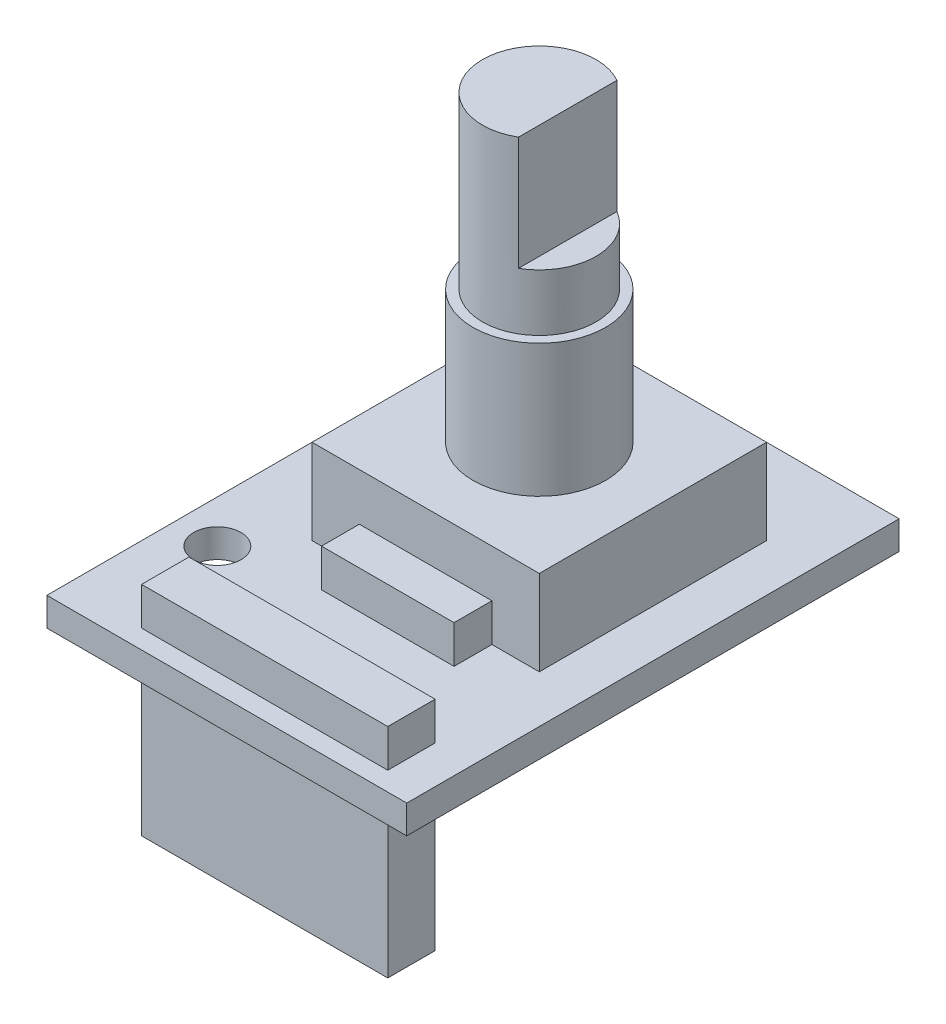
ISO-10303-21;
HEADER;
FILE_DESCRIPTION(('STEP AP214'),'2;1');
FILE_NAME('part.step','',(''),(''),'','','');
FILE_SCHEMA(('AUTOMOTIVE_DESIGN { 1 0 10303 214 1 1 1 1 }'));
ENDSEC;
DATA;
#1=APPLICATION_CONTEXT('core data for automotive mechanical design processes');
#2=APPLICATION_PROTOCOL_DEFINITION('international standard','automotive_design',2000,#1);
#3=PRODUCT_CONTEXT('',#1,'mechanical');
#4=PRODUCT('Part','Part','',(#3));
#5=PRODUCT_RELATED_PRODUCT_CATEGORY('part','',(#4));
#6=PRODUCT_DEFINITION_FORMATION('','',#4);
#7=PRODUCT_DEFINITION_CONTEXT('part definition',#1,'design');
#8=PRODUCT_DEFINITION('design','',#6,#7);
#9=PRODUCT_DEFINITION_SHAPE('','',#8);
#10=(LENGTH_UNIT() NAMED_UNIT(*) SI_UNIT(.MILLI.,.METRE.));
#11=(NAMED_UNIT(*) PLANE_ANGLE_UNIT() SI_UNIT($,.RADIAN.));
#12=(NAMED_UNIT(*) SI_UNIT($,.STERADIAN.) SOLID_ANGLE_UNIT());
#13=UNCERTAINTY_MEASURE_WITH_UNIT(LENGTH_MEASURE(1.E-05),#10,'distance_accuracy_value','');
#14=(GEOMETRIC_REPRESENTATION_CONTEXT(3) GLOBAL_UNCERTAINTY_ASSIGNED_CONTEXT((#13)) GLOBAL_UNIT_ASSIGNED_CONTEXT((#10,
#11,#12)) REPRESENTATION_CONTEXT('',''));
#15=CARTESIAN_POINT('',(0.,0.,0.));
#16=DIRECTION('',(0.,0.,1.));
#17=DIRECTION('',(1.,0.,0.));
#18=AXIS2_PLACEMENT_3D('',#15,#16,#17);
#19=CARTESIAN_POINT('',(0.,1.5,0.));
#20=DIRECTION('',(0.,-1.,0.));
#21=DIRECTION('',(0.,0.,-1.));
#22=AXIS2_PLACEMENT_3D('',#19,#20,#21);
#23=PLANE('',#22);
#24=DIRECTION('',(-1.,0.,0.));
#25=VECTOR('',#24,1.);
#26=CARTESIAN_POINT('',(0.,1.5,12.));
#27=LINE('',#26,#25);
#28=CARTESIAN_POINT('',(7.5,1.5,12.));
#29=VERTEX_POINT('',#28);
#30=CARTESIAN_POINT('',(-5.5,1.5,12.));
#31=VERTEX_POINT('',#30);
#32=EDGE_CURVE('E360',#29,#31,#27,.T.);
#33=ORIENTED_EDGE('',*,*,#32,.T.);
#34=DIRECTION('',(0.,0.,-1.));
#35=VECTOR('',#34,1.);
#36=CARTESIAN_POINT('',(-5.5,1.5,0.));
#37=LINE('',#36,#35);
#38=CARTESIAN_POINT('',(-5.5,1.5,9.5));
#39=VERTEX_POINT('',#38);
#40=EDGE_CURVE('E369',#31,#39,#37,.T.);
#41=ORIENTED_EDGE('',*,*,#40,.T.);
#42=DIRECTION('',(1.,0.,0.));
#43=VECTOR('',#42,1.);
#44=CARTESIAN_POINT('',(0.,1.5,9.5));
#45=LINE('',#44,#43);
#46=CARTESIAN_POINT('',(7.5,1.5,9.5));
#47=VERTEX_POINT('',#46);
#48=EDGE_CURVE('E366',#39,#47,#45,.T.);
#49=ORIENTED_EDGE('',*,*,#48,.T.);
#50=DIRECTION('',(0.,0.,1.));
#51=VECTOR('',#50,1.);
#52=CARTESIAN_POINT('',(7.5,1.5,0.));
#53=LINE('',#52,#51);
#54=EDGE_CURVE('E363',#47,#29,#53,.T.);
#55=ORIENTED_EDGE('',*,*,#54,.T.);
#56=EDGE_LOOP('',(#33,#41,#49,#55));
#57=FACE_BOUND('',#56,.T.);
#58=CARTESIAN_POINT('',(-7.25,1.5,-7.75));
#59=DIRECTION('',(0.,1.,0.));
#60=DIRECTION('',(0.,0.,1.));
#61=AXIS2_PLACEMENT_3D('',#58,#59,#60);
#62=CIRCLE('',#61,1.25);
#63=CARTESIAN_POINT('',(-7.25,1.5,-6.5));
#64=VERTEX_POINT('',#63);
#65=EDGE_CURVE('E321',#64,#64,#62,.T.);
#66=ORIENTED_EDGE('',*,*,#65,.F.);
#67=EDGE_LOOP('',(#66));
#68=FACE_BOUND('',#67,.T.);
#69=CARTESIAN_POINT('',(-7.25,1.5,6.25));
#70=DIRECTION('',(0.,1.,0.));
#71=DIRECTION('',(0.,0.,1.));
#72=AXIS2_PLACEMENT_3D('',#69,#70,#71);
#73=CIRCLE('',#72,1.25);
#74=CARTESIAN_POINT('',(-7.25,1.5,7.5));
#75=VERTEX_POINT('',#74);
#76=EDGE_CURVE('E372',#75,#75,#73,.T.);
#77=ORIENTED_EDGE('',*,*,#76,.F.);
#78=EDGE_LOOP('',(#77));
#79=FACE_BOUND('',#78,.T.);
#80=DIRECTION('',(0.,0.,1.));
#81=VECTOR('',#80,1.);
#82=CARTESIAN_POINT('',(-9.5,1.5,13.));
#83=LINE('',#82,#81);
#84=CARTESIAN_POINT('',(-9.5,1.5,-13.));
#85=VERTEX_POINT('',#84);
#86=CARTESIAN_POINT('',(-9.5,1.5,13.));
#87=VERTEX_POINT('',#86);
#88=EDGE_CURVE('E287',#85,#87,#83,.T.);
#89=ORIENTED_EDGE('',*,*,#88,.T.);
#90=DIRECTION('',(1.,0.,0.));
#91=VECTOR('',#90,1.);
#92=CARTESIAN_POINT('',(-9.5,1.5,13.));
#93=LINE('',#92,#91);
#94=CARTESIAN_POINT('',(9.5,1.5,13.));
#95=VERTEX_POINT('',#94);
#96=EDGE_CURVE('E290',#87,#95,#93,.T.);
#97=ORIENTED_EDGE('',*,*,#96,.T.);
#98=DIRECTION('',(0.,0.,-1.));
#99=VECTOR('',#98,1.);
#100=CARTESIAN_POINT('',(9.5,1.5,13.));
#101=LINE('',#100,#99);
#102=CARTESIAN_POINT('',(9.5,1.5,-13.));
#103=VERTEX_POINT('',#102);
#104=EDGE_CURVE('E293',#95,#103,#101,.T.);
#105=ORIENTED_EDGE('',*,*,#104,.T.);
#106=DIRECTION('',(-1.,0.,0.));
#107=VECTOR('',#106,1.);
#108=CARTESIAN_POINT('',(-9.5,1.5,-13.));
#109=LINE('',#108,#107);
#110=EDGE_CURVE('E295',#103,#85,#109,.T.);
#111=ORIENTED_EDGE('',*,*,#110,.T.);
#112=EDGE_LOOP('',(#89,#97,#105,#111));
#113=FACE_BOUND('',#112,.T.);
#114=DIRECTION('',(0.,0.,1.));
#115=VECTOR('',#114,1.);
#116=CARTESIAN_POINT('',(-2.5,1.5,3.5));
#117=LINE('',#116,#115);
#118=CARTESIAN_POINT('',(-2.5,1.5,3.5));
#119=VERTEX_POINT('',#118);
#120=CARTESIAN_POINT('',(-2.5,1.5,5.5));
#121=VERTEX_POINT('',#120);
#122=EDGE_CURVE('E242',#119,#121,#117,.T.);
#123=ORIENTED_EDGE('',*,*,#122,.F.);
#124=DIRECTION('',(1.,0.,0.));
#125=VECTOR('',#124,1.);
#126=CARTESIAN_POINT('',(-5.,1.5,3.5));
#127=LINE('',#126,#125);
#128=CARTESIAN_POINT('',(-5.,1.5,3.5));
#129=VERTEX_POINT('',#128);
#130=EDGE_CURVE('E252',#129,#119,#127,.T.);
#131=ORIENTED_EDGE('',*,*,#130,.F.);
#132=DIRECTION('',(0.,0.,1.));
#133=VECTOR('',#132,1.);
#134=CARTESIAN_POINT('',(-5.,1.5,3.5));
#135=LINE('',#134,#133);
#136=CARTESIAN_POINT('',(-5.,1.5,-8.5));
#137=VERTEX_POINT('',#136);
#138=EDGE_CURVE('E267',#137,#129,#135,.T.);
#139=ORIENTED_EDGE('',*,*,#138,.F.);
#140=DIRECTION('',(-1.,0.,0.));
#141=VECTOR('',#140,1.);
#142=CARTESIAN_POINT('',(-5.,1.5,-8.5));
#143=LINE('',#142,#141);
#144=CARTESIAN_POINT('',(-2.5,1.5,-8.5));
#145=VERTEX_POINT('',#144);
#146=EDGE_CURVE('E265',#145,#137,#143,.T.);
#147=ORIENTED_EDGE('',*,*,#146,.F.);
#148=DIRECTION('',(0.,0.,1.));
#149=VECTOR('',#148,1.);
#150=CARTESIAN_POINT('',(-2.5,1.5,-8.5));
#151=LINE('',#150,#149);
#152=CARTESIAN_POINT('',(-2.5,1.5,-10.5));
#153=VERTEX_POINT('',#152);
#154=EDGE_CURVE('E61',#153,#145,#151,.T.);
#155=ORIENTED_EDGE('',*,*,#154,.F.);
#156=DIRECTION('',(-1.,0.,0.));
#157=VECTOR('',#156,1.);
#158=CARTESIAN_POINT('',(-2.5,1.5,-10.5));
#159=LINE('',#158,#157);
#160=CARTESIAN_POINT('',(4.5,1.5,-10.5));
#161=VERTEX_POINT('',#160);
#162=EDGE_CURVE('E425',#161,#153,#159,.T.);
#163=ORIENTED_EDGE('',*,*,#162,.F.);
#164=DIRECTION('',(0.,0.,-1.));
#165=VECTOR('',#164,1.);
#166=CARTESIAN_POINT('',(4.5,1.5,-8.5));
#167=LINE('',#166,#165);
#168=CARTESIAN_POINT('',(4.5,1.5,-8.5));
#169=VERTEX_POINT('',#168);
#170=EDGE_CURVE('E422',#169,#161,#167,.T.);
#171=ORIENTED_EDGE('',*,*,#170,.F.);
#172=CARTESIAN_POINT('',(7.,1.5,-8.5));
#173=VERTEX_POINT('',#172);
#174=EDGE_CURVE('E271',#173,#169,#143,.T.);
#175=ORIENTED_EDGE('',*,*,#174,.F.);
#176=DIRECTION('',(0.,0.,-1.));
#177=VECTOR('',#176,1.);
#178=CARTESIAN_POINT('',(7.,1.5,3.5));
#179=LINE('',#178,#177);
#180=CARTESIAN_POINT('',(7.,1.5,3.5));
#181=VERTEX_POINT('',#180);
#182=EDGE_CURVE('E261',#181,#173,#179,.T.);
#183=ORIENTED_EDGE('',*,*,#182,.F.);
#184=CARTESIAN_POINT('',(4.5,1.5,3.5));
#185=VERTEX_POINT('',#184);
#186=EDGE_CURVE('E262',#185,#181,#127,.T.);
#187=ORIENTED_EDGE('',*,*,#186,.F.);
#188=DIRECTION('',(0.,0.,-1.));
#189=VECTOR('',#188,1.);
#190=CARTESIAN_POINT('',(4.5,1.5,3.5));
#191=LINE('',#190,#189);
#192=CARTESIAN_POINT('',(4.5,1.5,5.5));
#193=VERTEX_POINT('',#192);
#194=EDGE_CURVE('E668',#193,#185,#191,.T.);
#195=ORIENTED_EDGE('',*,*,#194,.F.);
#196=DIRECTION('',(1.,0.,0.));
#197=VECTOR('',#196,1.);
#198=CARTESIAN_POINT('',(-2.5,1.5,5.5));
#199=LINE('',#198,#197);
#200=EDGE_CURVE('E255',#121,#193,#199,.T.);
#201=ORIENTED_EDGE('',*,*,#200,.F.);
#202=EDGE_LOOP('',(#123,#131,#139,#147,#155,#163,#171,#175,#183,#187,#195,#201));
#203=FACE_BOUND('',#202,.T.);
#204=ADVANCED_FACE('F38',(#57,#68,#79,#113,#203),#23,.F.);
#205=CARTESIAN_POINT('',(-5.,6.,3.5));
#206=DIRECTION('',(0.,0.,-1.));
#207=DIRECTION('',(-1.,0.,0.));
#208=AXIS2_PLACEMENT_3D('',#205,#206,#207);
#209=PLANE('',#208);
#210=DIRECTION('',(0.,-1.,0.));
#211=VECTOR('',#210,1.);
#212=CARTESIAN_POINT('',(-2.5,3.5,3.5));
#213=LINE('',#212,#211);
#214=CARTESIAN_POINT('',(-2.5,3.5,3.5));
#215=VERTEX_POINT('',#214);
#216=EDGE_CURVE('E238',#215,#119,#213,.T.);
#217=ORIENTED_EDGE('',*,*,#216,.F.);
#218=DIRECTION('',(-1.,0.,0.));
#219=VECTOR('',#218,1.);
#220=CARTESIAN_POINT('',(-2.5,3.5,3.5));
#221=LINE('',#220,#219);
#222=CARTESIAN_POINT('',(4.5,3.5,3.5));
#223=VERTEX_POINT('',#222);
#224=EDGE_CURVE('E249',#223,#215,#221,.T.);
#225=ORIENTED_EDGE('',*,*,#224,.F.);
#226=DIRECTION('',(0.,-1.,0.));
#227=VECTOR('',#226,1.);
#228=CARTESIAN_POINT('',(4.5,3.5,3.5));
#229=LINE('',#228,#227);
#230=EDGE_CURVE('E53',#223,#185,#229,.T.);
#231=ORIENTED_EDGE('',*,*,#230,.T.);
#232=ORIENTED_EDGE('',*,*,#186,.T.);
#233=DIRECTION('',(0.,-1.,0.));
#234=VECTOR('',#233,1.);
#235=CARTESIAN_POINT('',(7.,6.,3.5));
#236=LINE('',#235,#234);
#237=CARTESIAN_POINT('',(7.,6.,3.5));
#238=VERTEX_POINT('',#237);
#239=EDGE_CURVE('E282',#238,#181,#236,.T.);
#240=ORIENTED_EDGE('',*,*,#239,.F.);
#241=DIRECTION('',(1.,0.,0.));
#242=VECTOR('',#241,1.);
#243=CARTESIAN_POINT('',(-5.,6.,3.5));
#244=LINE('',#243,#242);
#245=CARTESIAN_POINT('',(-5.,6.,3.5));
#246=VERTEX_POINT('',#245);
#247=EDGE_CURVE('E400',#246,#238,#244,.T.);
#248=ORIENTED_EDGE('',*,*,#247,.F.);
#249=DIRECTION('',(0.,-1.,0.));
#250=VECTOR('',#249,1.);
#251=CARTESIAN_POINT('',(-5.,6.,3.5));
#252=LINE('',#251,#250);
#253=EDGE_CURVE('E259',#246,#129,#252,.T.);
#254=ORIENTED_EDGE('',*,*,#253,.T.);
#255=ORIENTED_EDGE('',*,*,#130,.T.);
#256=EDGE_LOOP('',(#217,#225,#231,#232,#240,#248,#254,#255));
#257=FACE_BOUND('',#256,.T.);
#258=ADVANCED_FACE('F257',(#257),#209,.F.);
#259=CARTESIAN_POINT('',(-5.,6.,-8.5));
#260=DIRECTION('',(0.,0.,1.));
#261=DIRECTION('',(1.,0.,0.));
#262=AXIS2_PLACEMENT_3D('',#259,#260,#261);
#263=PLANE('',#262);
#264=DIRECTION('',(0.,-1.,0.));
#265=VECTOR('',#264,1.);
#266=CARTESIAN_POINT('',(-2.5,3.5,-8.5));
#267=LINE('',#266,#265);
#268=CARTESIAN_POINT('',(-2.5,3.5,-8.5));
#269=VERTEX_POINT('',#268);
#270=EDGE_CURVE('E419',#269,#145,#267,.T.);
#271=ORIENTED_EDGE('',*,*,#270,.T.);
#272=ORIENTED_EDGE('',*,*,#146,.T.);
#273=DIRECTION('',(0.,-1.,0.));
#274=VECTOR('',#273,1.);
#275=CARTESIAN_POINT('',(-5.,6.,-8.5));
#276=LINE('',#275,#274);
#277=CARTESIAN_POINT('',(-5.,6.,-8.5));
#278=VERTEX_POINT('',#277);
#279=EDGE_CURVE('E275',#278,#137,#276,.T.);
#280=ORIENTED_EDGE('',*,*,#279,.F.);
#281=DIRECTION('',(-1.,0.,0.));
#282=VECTOR('',#281,1.);
#283=CARTESIAN_POINT('',(-5.,6.,-8.5));
#284=LINE('',#283,#282);
#285=CARTESIAN_POINT('',(7.,6.,-8.5));
#286=VERTEX_POINT('',#285);
#287=EDGE_CURVE('E279',#286,#278,#284,.T.);
#288=ORIENTED_EDGE('',*,*,#287,.F.);
#289=DIRECTION('',(0.,-1.,0.));
#290=VECTOR('',#289,1.);
#291=CARTESIAN_POINT('',(7.,6.,-8.5));
#292=LINE('',#291,#290);
#293=EDGE_CURVE('E278',#286,#173,#292,.T.);
#294=ORIENTED_EDGE('',*,*,#293,.T.);
#295=ORIENTED_EDGE('',*,*,#174,.T.);
#296=DIRECTION('',(0.,-1.,0.));
#297=VECTOR('',#296,1.);
#298=CARTESIAN_POINT('',(4.5,3.5,-8.5));
#299=LINE('',#298,#297);
#300=CARTESIAN_POINT('',(4.5,3.5,-8.5));
#301=VERTEX_POINT('',#300);
#302=EDGE_CURVE('E437',#301,#169,#299,.T.);
#303=ORIENTED_EDGE('',*,*,#302,.F.);
#304=DIRECTION('',(1.,0.,0.));
#305=VECTOR('',#304,1.);
#306=CARTESIAN_POINT('',(-2.5,3.5,-8.5));
#307=LINE('',#306,#305);
#308=EDGE_CURVE('E662',#269,#301,#307,.T.);
#309=ORIENTED_EDGE('',*,*,#308,.F.);
#310=EDGE_LOOP('',(#271,#272,#280,#288,#294,#295,#303,#309));
#311=FACE_BOUND('',#310,.T.);
#312=ADVANCED_FACE('F411',(#311),#263,.F.);
#313=CARTESIAN_POINT('',(0.,0.,0.));
#314=DIRECTION('',(0.,-1.,0.));
#315=DIRECTION('',(0.,0.,-1.));
#316=AXIS2_PLACEMENT_3D('',#313,#314,#315);
#317=PLANE('',#316);
#318=DIRECTION('',(0.,0.,-1.));
#319=VECTOR('',#318,1.);
#320=CARTESIAN_POINT('',(-5.5,0.,0.));
#321=LINE('',#320,#319);
#322=CARTESIAN_POINT('',(-5.5,0.,12.));
#323=VERTEX_POINT('',#322);
#324=CARTESIAN_POINT('',(-5.5,0.,9.5));
#325=VERTEX_POINT('',#324);
#326=EDGE_CURVE('E11',#323,#325,#321,.T.);
#327=ORIENTED_EDGE('',*,*,#326,.F.);
#328=DIRECTION('',(-1.,0.,0.));
#329=VECTOR('',#328,1.);
#330=CARTESIAN_POINT('',(0.,0.,12.));
#331=LINE('',#330,#329);
#332=CARTESIAN_POINT('',(7.5,0.,12.));
#333=VERTEX_POINT('',#332);
#334=EDGE_CURVE('E325',#333,#323,#331,.T.);
#335=ORIENTED_EDGE('',*,*,#334,.F.);
#336=DIRECTION('',(0.,0.,1.));
#337=VECTOR('',#336,1.);
#338=CARTESIAN_POINT('',(7.5,0.,0.));
#339=LINE('',#338,#337);
#340=CARTESIAN_POINT('',(7.5,0.,9.5));
#341=VERTEX_POINT('',#340);
#342=EDGE_CURVE('E328',#341,#333,#339,.T.);
#343=ORIENTED_EDGE('',*,*,#342,.F.);
#344=DIRECTION('',(1.,0.,0.));
#345=VECTOR('',#344,1.);
#346=CARTESIAN_POINT('',(0.,0.,9.5));
#347=LINE('',#346,#345);
#348=EDGE_CURVE('E46',#325,#341,#347,.T.);
#349=ORIENTED_EDGE('',*,*,#348,.F.);
#350=EDGE_LOOP('',(#327,#335,#343,#349));
#351=FACE_BOUND('',#350,.T.);
#352=CARTESIAN_POINT('',(-7.25,0.,-7.75));
#353=DIRECTION('',(0.,-1.,0.));
#354=DIRECTION('',(0.,0.,-1.));
#355=AXIS2_PLACEMENT_3D('',#352,#353,#354);
#356=CIRCLE('',#355,1.25);
#357=CARTESIAN_POINT('',(-7.25,0.,-9.));
#358=VERTEX_POINT('',#357);
#359=EDGE_CURVE('E320',#358,#358,#356,.T.);
#360=ORIENTED_EDGE('',*,*,#359,.F.);
#361=EDGE_LOOP('',(#360));
#362=FACE_BOUND('',#361,.T.);
#363=CARTESIAN_POINT('',(-7.25,0.,6.25));
#364=DIRECTION('',(0.,-1.,0.));
#365=DIRECTION('',(0.,0.,-1.));
#366=AXIS2_PLACEMENT_3D('',#363,#364,#365);
#367=CIRCLE('',#366,1.25);
#368=CARTESIAN_POINT('',(-7.25,0.,5.));
#369=VERTEX_POINT('',#368);
#370=EDGE_CURVE('E317',#369,#369,#367,.T.);
#371=ORIENTED_EDGE('',*,*,#370,.F.);
#372=EDGE_LOOP('',(#371));
#373=FACE_BOUND('',#372,.T.);
#374=DIRECTION('',(0.,0.,1.));
#375=VECTOR('',#374,1.);
#376=CARTESIAN_POINT('',(-9.5,0.,13.));
#377=LINE('',#376,#375);
#378=CARTESIAN_POINT('',(-9.5,0.,-13.));
#379=VERTEX_POINT('',#378);
#380=CARTESIAN_POINT('',(-9.5,0.,13.));
#381=VERTEX_POINT('',#380);
#382=EDGE_CURVE('E286',#379,#381,#377,.T.);
#383=ORIENTED_EDGE('',*,*,#382,.F.);
#384=DIRECTION('',(-1.,0.,0.));
#385=VECTOR('',#384,1.);
#386=CARTESIAN_POINT('',(-9.5,0.,-13.));
#387=LINE('',#386,#385);
#388=CARTESIAN_POINT('',(9.5,0.,-13.));
#389=VERTEX_POINT('',#388);
#390=EDGE_CURVE('E291',#389,#379,#387,.T.);
#391=ORIENTED_EDGE('',*,*,#390,.F.);
#392=DIRECTION('',(0.,0.,-1.));
#393=VECTOR('',#392,1.);
#394=CARTESIAN_POINT('',(9.5,0.,13.));
#395=LINE('',#394,#393);
#396=CARTESIAN_POINT('',(9.5,0.,13.));
#397=VERTEX_POINT('',#396);
#398=EDGE_CURVE('E302',#397,#389,#395,.T.);
#399=ORIENTED_EDGE('',*,*,#398,.F.);
#400=DIRECTION('',(1.,0.,0.));
#401=VECTOR('',#400,1.);
#402=CARTESIAN_POINT('',(-9.5,0.,13.));
#403=LINE('',#402,#401);
#404=EDGE_CURVE('E300',#381,#397,#403,.T.);
#405=ORIENTED_EDGE('',*,*,#404,.F.);
#406=EDGE_LOOP('',(#383,#391,#399,#405));
#407=FACE_BOUND('',#406,.T.);
#408=DIRECTION('',(1.,0.,0.));
#409=VECTOR('',#408,1.);
#410=CARTESIAN_POINT('',(-2.75,0.,-12.));
#411=LINE('',#410,#409);
#412=CARTESIAN_POINT('',(-2.75,0.,-12.));
#413=VERTEX_POINT('',#412);
#414=CARTESIAN_POINT('',(6.5,0.,-12.));
#415=VERTEX_POINT('',#414);
#416=EDGE_CURVE('E455',#413,#415,#411,.T.);
#417=ORIENTED_EDGE('',*,*,#416,.F.);
#418=DIRECTION('',(0.,0.,-1.));
#419=VECTOR('',#418,1.);
#420=CARTESIAN_POINT('',(-2.75,0.,6.5));
#421=LINE('',#420,#419);
#422=CARTESIAN_POINT('',(-2.75,0.,6.5));
#423=VERTEX_POINT('',#422);
#424=EDGE_CURVE('E441',#423,#413,#421,.T.);
#425=ORIENTED_EDGE('',*,*,#424,.F.);
#426=DIRECTION('',(-1.,0.,0.));
#427=VECTOR('',#426,1.);
#428=CARTESIAN_POINT('',(-2.75,0.,6.5));
#429=LINE('',#428,#427);
#430=CARTESIAN_POINT('',(6.5,0.,6.5));
#431=VERTEX_POINT('',#430);
#432=EDGE_CURVE('E446',#431,#423,#429,.T.);
#433=ORIENTED_EDGE('',*,*,#432,.F.);
#434=DIRECTION('',(0.,0.,1.));
#435=VECTOR('',#434,1.);
#436=CARTESIAN_POINT('',(6.5,0.,6.5));
#437=LINE('',#436,#435);
#438=EDGE_CURVE('E457',#415,#431,#437,.T.);
#439=ORIENTED_EDGE('',*,*,#438,.F.);
#440=EDGE_LOOP('',(#417,#425,#433,#439));
#441=FACE_BOUND('',#440,.T.);
#442=ADVANCED_FACE('F527',(#351,#362,#373,#407,#441),#317,.T.);
#443=CARTESIAN_POINT('',(-9.5,1.5,13.));
#444=DIRECTION('',(1.,0.,0.));
#445=DIRECTION('',(0.,0.,-1.));
#446=AXIS2_PLACEMENT_3D('',#443,#444,#445);
#447=PLANE('',#446);
#448=ORIENTED_EDGE('',*,*,#382,.T.);
#449=DIRECTION('',(0.,-1.,0.));
#450=VECTOR('',#449,1.);
#451=CARTESIAN_POINT('',(-9.5,1.5,13.));
#452=LINE('',#451,#450);
#453=EDGE_CURVE('E313',#87,#381,#452,.T.);
#454=ORIENTED_EDGE('',*,*,#453,.F.);
#455=ORIENTED_EDGE('',*,*,#88,.F.);
#456=DIRECTION('',(0.,-1.,0.));
#457=VECTOR('',#456,1.);
#458=CARTESIAN_POINT('',(-9.5,1.5,-13.));
#459=LINE('',#458,#457);
#460=EDGE_CURVE('E297',#85,#379,#459,.T.);
#461=ORIENTED_EDGE('',*,*,#460,.T.);
#462=EDGE_LOOP('',(#448,#454,#455,#461));
#463=FACE_BOUND('',#462,.T.);
#464=ADVANCED_FACE('F40',(#463),#447,.F.);
#465=CARTESIAN_POINT('',(-9.5,1.5,13.));
#466=DIRECTION('',(0.,0.,-1.));
#467=DIRECTION('',(-1.,0.,0.));
#468=AXIS2_PLACEMENT_3D('',#465,#466,#467);
#469=PLANE('',#468);
#470=ORIENTED_EDGE('',*,*,#404,.T.);
#471=DIRECTION('',(0.,-1.,0.));
#472=VECTOR('',#471,1.);
#473=CARTESIAN_POINT('',(9.5,1.5,13.));
#474=LINE('',#473,#472);
#475=EDGE_CURVE('E310',#95,#397,#474,.T.);
#476=ORIENTED_EDGE('',*,*,#475,.F.);
#477=ORIENTED_EDGE('',*,*,#96,.F.);
#478=ORIENTED_EDGE('',*,*,#453,.T.);
#479=EDGE_LOOP('',(#470,#476,#477,#478));
#480=FACE_BOUND('',#479,.T.);
#481=ADVANCED_FACE('F536',(#480),#469,.F.);
#482=CARTESIAN_POINT('',(9.5,1.5,13.));
#483=DIRECTION('',(-1.,0.,0.));
#484=DIRECTION('',(0.,0.,1.));
#485=AXIS2_PLACEMENT_3D('',#482,#483,#484);
#486=PLANE('',#485);
#487=ORIENTED_EDGE('',*,*,#398,.T.);
#488=DIRECTION('',(0.,-1.,0.));
#489=VECTOR('',#488,1.);
#490=CARTESIAN_POINT('',(9.5,1.5,-13.));
#491=LINE('',#490,#489);
#492=EDGE_CURVE('E307',#103,#389,#491,.T.);
#493=ORIENTED_EDGE('',*,*,#492,.F.);
#494=ORIENTED_EDGE('',*,*,#104,.F.);
#495=ORIENTED_EDGE('',*,*,#475,.T.);
#496=EDGE_LOOP('',(#487,#493,#494,#495));
#497=FACE_BOUND('',#496,.T.);
#498=ADVANCED_FACE('F533',(#497),#486,.F.);
#499=CARTESIAN_POINT('',(-9.5,1.5,-13.));
#500=DIRECTION('',(0.,0.,1.));
#501=DIRECTION('',(1.,0.,0.));
#502=AXIS2_PLACEMENT_3D('',#499,#500,#501);
#503=PLANE('',#502);
#504=ORIENTED_EDGE('',*,*,#390,.T.);
#505=ORIENTED_EDGE('',*,*,#460,.F.);
#506=ORIENTED_EDGE('',*,*,#110,.F.);
#507=ORIENTED_EDGE('',*,*,#492,.T.);
#508=EDGE_LOOP('',(#504,#505,#506,#507));
#509=FACE_BOUND('',#508,.T.);
#510=ADVANCED_FACE('F530',(#509),#503,.F.);
#511=CARTESIAN_POINT('',(-5.,6.,3.5));
#512=DIRECTION('',(1.,0.,0.));
#513=DIRECTION('',(0.,0.,-1.));
#514=AXIS2_PLACEMENT_3D('',#511,#512,#513);
#515=PLANE('',#514);
#516=ORIENTED_EDGE('',*,*,#138,.T.);
#517=ORIENTED_EDGE('',*,*,#253,.F.);
#518=DIRECTION('',(0.,0.,1.));
#519=VECTOR('',#518,1.);
#520=CARTESIAN_POINT('',(-5.,6.,3.5));
#521=LINE('',#520,#519);
#522=EDGE_CURVE('E274',#278,#246,#521,.T.);
#523=ORIENTED_EDGE('',*,*,#522,.F.);
#524=ORIENTED_EDGE('',*,*,#279,.T.);
#525=EDGE_LOOP('',(#516,#517,#523,#524));
#526=FACE_BOUND('',#525,.T.);
#527=ADVANCED_FACE('F413',(#526),#515,.F.);
#528=CARTESIAN_POINT('',(7.,6.,3.5));
#529=DIRECTION('',(-1.,0.,0.));
#530=DIRECTION('',(0.,0.,1.));
#531=AXIS2_PLACEMENT_3D('',#528,#529,#530);
#532=PLANE('',#531);
#533=ORIENTED_EDGE('',*,*,#182,.T.);
#534=ORIENTED_EDGE('',*,*,#293,.F.);
#535=DIRECTION('',(0.,0.,-1.));
#536=VECTOR('',#535,1.);
#537=CARTESIAN_POINT('',(7.,6.,3.5));
#538=LINE('',#537,#536);
#539=EDGE_CURVE('E402',#238,#286,#538,.T.);
#540=ORIENTED_EDGE('',*,*,#539,.F.);
#541=ORIENTED_EDGE('',*,*,#239,.T.);
#542=EDGE_LOOP('',(#533,#534,#540,#541));
#543=FACE_BOUND('',#542,.T.);
#544=ADVANCED_FACE('F642',(#543),#532,.F.);
#545=CARTESIAN_POINT('',(0.,6.,0.));
#546=DIRECTION('',(0.,-1.,0.));
#547=DIRECTION('',(0.,0.,-1.));
#548=AXIS2_PLACEMENT_3D('',#545,#546,#547);
#549=PLANE('',#548);
#550=CARTESIAN_POINT('',(0.999999999999999,6.,-2.5));
#551=DIRECTION('',(0.,1.,0.));
#552=DIRECTION('',(0.,0.,1.));
#553=AXIS2_PLACEMENT_3D('',#550,#551,#552);
#554=CIRCLE('',#553,3.5);
#555=CARTESIAN_POINT('',(0.999999999999999,6.,1.));
#556=VERTEX_POINT('',#555);
#557=EDGE_CURVE('E316',#556,#556,#554,.T.);
#558=ORIENTED_EDGE('',*,*,#557,.F.);
#559=EDGE_LOOP('',(#558));
#560=FACE_BOUND('',#559,.T.);
#561=ORIENTED_EDGE('',*,*,#522,.T.);
#562=ORIENTED_EDGE('',*,*,#247,.T.);
#563=ORIENTED_EDGE('',*,*,#539,.T.);
#564=ORIENTED_EDGE('',*,*,#287,.T.);
#565=EDGE_LOOP('',(#561,#562,#563,#564));
#566=FACE_BOUND('',#565,.T.);
#567=ADVANCED_FACE('F406',(#560,#566),#549,.F.);
#568=CARTESIAN_POINT('',(0.999999999999999,13.,-2.5));
#569=DIRECTION('',(0.,-1.,0.));
#570=DIRECTION('',(0.,0.,-1.));
#571=AXIS2_PLACEMENT_3D('',#568,#569,#570);
#572=CYLINDRICAL_SURFACE('',#571,3.5);
#573=CARTESIAN_POINT('',(0.999999999999999,13.,-2.5));
#574=DIRECTION('',(0.,1.,0.));
#575=DIRECTION('',(0.,0.,1.));
#576=AXIS2_PLACEMENT_3D('',#573,#574,#575);
#577=CIRCLE('',#576,3.5);
#578=CARTESIAN_POINT('',(0.999999999999999,13.,1.));
#579=VERTEX_POINT('',#578);
#580=EDGE_CURVE('E391',#579,#579,#577,.T.);
#581=ORIENTED_EDGE('',*,*,#580,.F.);
#582=EDGE_LOOP('',(#581));
#583=FACE_BOUND('',#582,.T.);
#584=ORIENTED_EDGE('',*,*,#557,.T.);
#585=EDGE_LOOP('',(#584));
#586=FACE_BOUND('',#585,.T.);
#587=ADVANCED_FACE('F635',(#583,#586),#572,.T.);
#588=CARTESIAN_POINT('',(0.999999999999999,13.,-2.5));
#589=DIRECTION('',(0.,1.,0.));
#590=DIRECTION('',(0.,0.,1.));
#591=AXIS2_PLACEMENT_3D('',#588,#589,#590);
#592=PLANE('',#591);
#593=CARTESIAN_POINT('',(0.999999999999999,13.,-2.5));
#594=DIRECTION('',(0.,1.,0.));
#595=DIRECTION('',(0.,0.,1.));
#596=AXIS2_PLACEMENT_3D('',#593,#594,#595);
#597=CIRCLE('',#596,3.);
#598=CARTESIAN_POINT('',(0.999999999999999,13.,0.5));
#599=VERTEX_POINT('',#598);
#600=EDGE_CURVE('E329',#599,#599,#597,.T.);
#601=ORIENTED_EDGE('',*,*,#600,.F.);
#602=EDGE_LOOP('',(#601));
#603=FACE_BOUND('',#602,.T.);
#604=ORIENTED_EDGE('',*,*,#580,.T.);
#605=EDGE_LOOP('',(#604));
#606=FACE_BOUND('',#605,.T.);
#607=ADVANCED_FACE('F631',(#603,#606),#592,.T.);
#608=CARTESIAN_POINT('',(0.999999999999999,22.,-2.5));
#609=DIRECTION('',(0.,-1.,0.));
#610=DIRECTION('',(0.,0.,-1.));
#611=AXIS2_PLACEMENT_3D('',#608,#609,#610);
#612=CYLINDRICAL_SURFACE('',#611,3.);
#613=CARTESIAN_POINT('',(0.999999999999999,22.,-2.5));
#614=DIRECTION('',(0.,1.,0.));
#615=DIRECTION('',(0.,0.,1.));
#616=AXIS2_PLACEMENT_3D('',#613,#614,#615);
#617=CIRCLE('',#616,3.);
#618=CARTESIAN_POINT('',(2.5,22.,-5.09807621135332));
#619=VERTEX_POINT('',#618);
#620=CARTESIAN_POINT('',(2.5,22.,0.0980762113533158));
#621=VERTEX_POINT('',#620);
#622=EDGE_CURVE('E387',#619,#621,#617,.T.);
#623=ORIENTED_EDGE('',*,*,#622,.F.);
#624=DIRECTION('',(0.,1.,0.));
#625=VECTOR('',#624,1.);
#626=CARTESIAN_POINT('',(2.5,16.,-5.09807621135332));
#627=LINE('',#626,#625);
#628=CARTESIAN_POINT('',(2.5,16.,-5.09807621135332));
#629=VERTEX_POINT('',#628);
#630=EDGE_CURVE('E382',#629,#619,#627,.T.);
#631=ORIENTED_EDGE('',*,*,#630,.F.);
#632=CARTESIAN_POINT('',(0.999999999999999,16.,-2.5));
#633=DIRECTION('',(0.,1.,0.));
#634=DIRECTION('',(0.,0.,1.));
#635=AXIS2_PLACEMENT_3D('',#632,#633,#634);
#636=CIRCLE('',#635,3.);
#637=CARTESIAN_POINT('',(2.5,16.,0.0980762113533158));
#638=VERTEX_POINT('',#637);
#639=EDGE_CURVE('E377',#638,#629,#636,.T.);
#640=ORIENTED_EDGE('',*,*,#639,.F.);
#641=DIRECTION('',(0.,1.,0.));
#642=VECTOR('',#641,1.);
#643=CARTESIAN_POINT('',(2.5,16.,0.0980762113533158));
#644=LINE('',#643,#642);
#645=EDGE_CURVE('E384',#638,#621,#644,.T.);
#646=ORIENTED_EDGE('',*,*,#645,.T.);
#647=EDGE_LOOP('',(#623,#631,#640,#646));
#648=FACE_BOUND('',#647,.T.);
#649=ORIENTED_EDGE('',*,*,#600,.T.);
#650=EDGE_LOOP('',(#649));
#651=FACE_BOUND('',#650,.T.);
#652=ADVANCED_FACE('F627',(#648,#651),#612,.T.);
#653=CARTESIAN_POINT('',(0.999999999999999,22.,-2.5));
#654=DIRECTION('',(0.,1.,0.));
#655=DIRECTION('',(0.,0.,1.));
#656=AXIS2_PLACEMENT_3D('',#653,#654,#655);
#657=PLANE('',#656);
#658=DIRECTION('',(0.,0.,1.));
#659=VECTOR('',#658,1.);
#660=CARTESIAN_POINT('',(2.5,22.,0.));
#661=LINE('',#660,#659);
#662=EDGE_CURVE('E324',#619,#621,#661,.T.);
#663=ORIENTED_EDGE('',*,*,#662,.F.);
#664=ORIENTED_EDGE('',*,*,#622,.T.);
#665=EDGE_LOOP('',(#663,#664));
#666=FACE_BOUND('',#665,.T.);
#667=ADVANCED_FACE('F623',(#666),#657,.T.);
#668=CARTESIAN_POINT('',(2.5,16.,0.));
#669=DIRECTION('',(-1.,0.,0.));
#670=DIRECTION('',(0.,0.,1.));
#671=AXIS2_PLACEMENT_3D('',#668,#669,#670);
#672=PLANE('',#671);
#673=ORIENTED_EDGE('',*,*,#662,.T.);
#674=ORIENTED_EDGE('',*,*,#645,.F.);
#675=DIRECTION('',(0.,0.,1.));
#676=VECTOR('',#675,1.);
#677=CARTESIAN_POINT('',(2.5,16.,0.));
#678=LINE('',#677,#676);
#679=EDGE_CURVE('E379',#629,#638,#678,.T.);
#680=ORIENTED_EDGE('',*,*,#679,.F.);
#681=ORIENTED_EDGE('',*,*,#630,.T.);
#682=EDGE_LOOP('',(#673,#674,#680,#681));
#683=FACE_BOUND('',#682,.T.);
#684=ADVANCED_FACE('F619',(#683),#672,.F.);
#685=CARTESIAN_POINT('',(0.,16.,0.));
#686=DIRECTION('',(0.,1.,0.));
#687=DIRECTION('',(0.,0.,1.));
#688=AXIS2_PLACEMENT_3D('',#685,#686,#687);
#689=PLANE('',#688);
#690=ORIENTED_EDGE('',*,*,#639,.T.);
#691=ORIENTED_EDGE('',*,*,#679,.T.);
#692=EDGE_LOOP('',(#690,#691));
#693=FACE_BOUND('',#692,.T.);
#694=ADVANCED_FACE('F615',(#693),#689,.T.);
#695=CARTESIAN_POINT('',(-7.25,-4.5,6.25));
#696=DIRECTION('',(0.,1.,0.));
#697=DIRECTION('',(0.,0.,1.));
#698=AXIS2_PLACEMENT_3D('',#695,#696,#697);
#699=CYLINDRICAL_SURFACE('',#698,1.25);
#700=ORIENTED_EDGE('',*,*,#370,.T.);
#701=EDGE_LOOP('',(#700));
#702=FACE_BOUND('',#701,.T.);
#703=ORIENTED_EDGE('',*,*,#76,.T.);
#704=EDGE_LOOP('',(#703));
#705=FACE_BOUND('',#704,.T.);
#706=ADVANCED_FACE('F611',(#702,#705),#699,.F.);
#707=CARTESIAN_POINT('',(-7.25,-4.5,-7.75));
#708=DIRECTION('',(0.,1.,0.));
#709=DIRECTION('',(0.,0.,1.));
#710=AXIS2_PLACEMENT_3D('',#707,#708,#709);
#711=CYLINDRICAL_SURFACE('',#710,1.25);
#712=ORIENTED_EDGE('',*,*,#359,.T.);
#713=EDGE_LOOP('',(#712));
#714=FACE_BOUND('',#713,.T.);
#715=ORIENTED_EDGE('',*,*,#65,.T.);
#716=EDGE_LOOP('',(#715));
#717=FACE_BOUND('',#716,.T.);
#718=ADVANCED_FACE('F596',(#714,#717),#711,.F.);
#719=CARTESIAN_POINT('',(0.,-8.,0.));
#720=DIRECTION('',(0.,-1.,0.));
#721=DIRECTION('',(0.,0.,-1.));
#722=AXIS2_PLACEMENT_3D('',#719,#720,#721);
#723=PLANE('',#722);
#724=DIRECTION('',(0.,0.,1.));
#725=VECTOR('',#724,1.);
#726=CARTESIAN_POINT('',(-5.5,-8.,12.));
#727=LINE('',#726,#725);
#728=CARTESIAN_POINT('',(-5.5,-8.,9.5));
#729=VERTEX_POINT('',#728);
#730=CARTESIAN_POINT('',(-5.5,-8.,12.));
#731=VERTEX_POINT('',#730);
#732=EDGE_CURVE('E482',#729,#731,#727,.T.);
#733=ORIENTED_EDGE('',*,*,#732,.F.);
#734=DIRECTION('',(-1.,0.,0.));
#735=VECTOR('',#734,1.);
#736=CARTESIAN_POINT('',(-5.5,-8.,9.5));
#737=LINE('',#736,#735);
#738=CARTESIAN_POINT('',(7.5,-8.,9.5));
#739=VERTEX_POINT('',#738);
#740=EDGE_CURVE('E488',#739,#729,#737,.T.);
#741=ORIENTED_EDGE('',*,*,#740,.F.);
#742=DIRECTION('',(0.,0.,-1.));
#743=VECTOR('',#742,1.);
#744=CARTESIAN_POINT('',(7.5,-8.,12.));
#745=LINE('',#744,#743);
#746=CARTESIAN_POINT('',(7.5,-8.,12.));
#747=VERTEX_POINT('',#746);
#748=EDGE_CURVE('E345',#747,#739,#745,.T.);
#749=ORIENTED_EDGE('',*,*,#748,.F.);
#750=DIRECTION('',(1.,0.,0.));
#751=VECTOR('',#750,1.);
#752=CARTESIAN_POINT('',(-5.5,-8.,12.));
#753=LINE('',#752,#751);
#754=EDGE_CURVE('E485',#731,#747,#753,.T.);
#755=ORIENTED_EDGE('',*,*,#754,.F.);
#756=EDGE_LOOP('',(#733,#741,#749,#755));
#757=FACE_BOUND('',#756,.T.);
#758=ADVANCED_FACE('F594',(#757),#723,.T.);
#759=CARTESIAN_POINT('',(-5.5,-8.,12.));
#760=DIRECTION('',(0.,0.,1.));
#761=DIRECTION('',(1.,0.,0.));
#762=AXIS2_PLACEMENT_3D('',#759,#760,#761);
#763=PLANE('',#762);
#764=DIRECTION('',(0.,1.,0.));
#765=VECTOR('',#764,1.);
#766=CARTESIAN_POINT('',(7.5,-8.,12.));
#767=LINE('',#766,#765);
#768=EDGE_CURVE('E351',#747,#333,#767,.T.);
#769=ORIENTED_EDGE('',*,*,#768,.T.);
#770=ORIENTED_EDGE('',*,*,#334,.T.);
#771=DIRECTION('',(0.,1.,0.));
#772=VECTOR('',#771,1.);
#773=CARTESIAN_POINT('',(-5.5,-8.,12.));
#774=LINE('',#773,#772);
#775=EDGE_CURVE('E356',#731,#323,#774,.T.);
#776=ORIENTED_EDGE('',*,*,#775,.F.);
#777=ORIENTED_EDGE('',*,*,#754,.T.);
#778=EDGE_LOOP('',(#769,#770,#776,#777));
#779=FACE_BOUND('',#778,.T.);
#780=ADVANCED_FACE('F516',(#779),#763,.T.);
#781=CARTESIAN_POINT('',(7.5,-8.,12.));
#782=DIRECTION('',(1.,0.,0.));
#783=DIRECTION('',(0.,0.,-1.));
#784=AXIS2_PLACEMENT_3D('',#781,#782,#783);
#785=PLANE('',#784);
#786=DIRECTION('',(0.,1.,0.));
#787=VECTOR('',#786,1.);
#788=CARTESIAN_POINT('',(7.5,-8.,9.5));
#789=LINE('',#788,#787);
#790=EDGE_CURVE('E337',#739,#341,#789,.T.);
#791=ORIENTED_EDGE('',*,*,#790,.T.);
#792=ORIENTED_EDGE('',*,*,#342,.T.);
#793=ORIENTED_EDGE('',*,*,#768,.F.);
#794=ORIENTED_EDGE('',*,*,#748,.T.);
#795=EDGE_LOOP('',(#791,#792,#793,#794));
#796=FACE_BOUND('',#795,.T.);
#797=ADVANCED_FACE('F342',(#796),#785,.T.);
#798=CARTESIAN_POINT('',(-5.5,-8.,9.5));
#799=DIRECTION('',(0.,0.,-1.));
#800=DIRECTION('',(-1.,0.,0.));
#801=AXIS2_PLACEMENT_3D('',#798,#799,#800);
#802=PLANE('',#801);
#803=DIRECTION('',(0.,1.,0.));
#804=VECTOR('',#803,1.);
#805=CARTESIAN_POINT('',(-5.5,-8.,9.5));
#806=LINE('',#805,#804);
#807=EDGE_CURVE('E339',#729,#325,#806,.T.);
#808=ORIENTED_EDGE('',*,*,#807,.T.);
#809=ORIENTED_EDGE('',*,*,#348,.T.);
#810=ORIENTED_EDGE('',*,*,#790,.F.);
#811=ORIENTED_EDGE('',*,*,#740,.T.);
#812=EDGE_LOOP('',(#808,#809,#810,#811));
#813=FACE_BOUND('',#812,.T.);
#814=ADVANCED_FACE('F335',(#813),#802,.T.);
#815=CARTESIAN_POINT('',(-5.5,-8.,12.));
#816=DIRECTION('',(-1.,0.,0.));
#817=DIRECTION('',(0.,0.,1.));
#818=AXIS2_PLACEMENT_3D('',#815,#816,#817);
#819=PLANE('',#818);
#820=ORIENTED_EDGE('',*,*,#775,.T.);
#821=ORIENTED_EDGE('',*,*,#326,.T.);
#822=ORIENTED_EDGE('',*,*,#807,.F.);
#823=ORIENTED_EDGE('',*,*,#732,.T.);
#824=EDGE_LOOP('',(#820,#821,#822,#823));
#825=FACE_BOUND('',#824,.T.);
#826=ADVANCED_FACE('F599',(#825),#819,.T.);
#827=ORIENTED_EDGE('',*,*,#40,.F.);
#828=CARTESIAN_POINT('',(-5.5,3.5,12.));
#829=VERTEX_POINT('',#828);
#830=EDGE_CURVE('E359',#31,#829,#774,.T.);
#831=ORIENTED_EDGE('',*,*,#830,.T.);
#832=DIRECTION('',(0.,0.,1.));
#833=VECTOR('',#832,1.);
#834=CARTESIAN_POINT('',(-5.5,3.5,12.));
#835=LINE('',#834,#833);
#836=CARTESIAN_POINT('',(-5.5,3.5,9.5));
#837=VERTEX_POINT('',#836);
#838=EDGE_CURVE('E470',#837,#829,#835,.T.);
#839=ORIENTED_EDGE('',*,*,#838,.F.);
#840=EDGE_CURVE('E347',#39,#837,#806,.T.);
#841=ORIENTED_EDGE('',*,*,#840,.F.);
#842=EDGE_LOOP('',(#827,#831,#839,#841));
#843=FACE_BOUND('',#842,.T.);
#844=ADVANCED_FACE('F493',(#843),#819,.T.);
#845=ORIENTED_EDGE('',*,*,#48,.F.);
#846=ORIENTED_EDGE('',*,*,#840,.T.);
#847=DIRECTION('',(-1.,0.,0.));
#848=VECTOR('',#847,1.);
#849=CARTESIAN_POINT('',(-5.5,3.5,9.5));
#850=LINE('',#849,#848);
#851=CARTESIAN_POINT('',(7.5,3.5,9.5));
#852=VERTEX_POINT('',#851);
#853=EDGE_CURVE('E479',#852,#837,#850,.T.);
#854=ORIENTED_EDGE('',*,*,#853,.F.);
#855=EDGE_CURVE('E348',#47,#852,#789,.T.);
#856=ORIENTED_EDGE('',*,*,#855,.F.);
#857=EDGE_LOOP('',(#845,#846,#854,#856));
#858=FACE_BOUND('',#857,.T.);
#859=ADVANCED_FACE('F504',(#858),#802,.T.);
#860=ORIENTED_EDGE('',*,*,#54,.F.);
#861=ORIENTED_EDGE('',*,*,#855,.T.);
#862=DIRECTION('',(0.,0.,-1.));
#863=VECTOR('',#862,1.);
#864=CARTESIAN_POINT('',(7.5,3.5,12.));
#865=LINE('',#864,#863);
#866=CARTESIAN_POINT('',(7.5,3.5,12.));
#867=VERTEX_POINT('',#866);
#868=EDGE_CURVE('E476',#867,#852,#865,.T.);
#869=ORIENTED_EDGE('',*,*,#868,.F.);
#870=EDGE_CURVE('E355',#29,#867,#767,.T.);
#871=ORIENTED_EDGE('',*,*,#870,.F.);
#872=EDGE_LOOP('',(#860,#861,#869,#871));
#873=FACE_BOUND('',#872,.T.);
#874=ADVANCED_FACE('F508',(#873),#785,.T.);
#875=ORIENTED_EDGE('',*,*,#32,.F.);
#876=ORIENTED_EDGE('',*,*,#870,.T.);
#877=DIRECTION('',(1.,0.,0.));
#878=VECTOR('',#877,1.);
#879=CARTESIAN_POINT('',(-5.5,3.5,12.));
#880=LINE('',#879,#878);
#881=EDGE_CURVE('E473',#829,#867,#880,.T.);
#882=ORIENTED_EDGE('',*,*,#881,.F.);
#883=ORIENTED_EDGE('',*,*,#830,.F.);
#884=EDGE_LOOP('',(#875,#876,#882,#883));
#885=FACE_BOUND('',#884,.T.);
#886=ADVANCED_FACE('F496',(#885),#763,.T.);
#887=CARTESIAN_POINT('',(0.,3.5,0.));
#888=DIRECTION('',(0.,-1.,0.));
#889=DIRECTION('',(0.,0.,-1.));
#890=AXIS2_PLACEMENT_3D('',#887,#888,#889);
#891=PLANE('',#890);
#892=ORIENTED_EDGE('',*,*,#838,.T.);
#893=ORIENTED_EDGE('',*,*,#881,.T.);
#894=ORIENTED_EDGE('',*,*,#868,.T.);
#895=ORIENTED_EDGE('',*,*,#853,.T.);
#896=EDGE_LOOP('',(#892,#893,#894,#895));
#897=FACE_BOUND('',#896,.T.);
#898=ADVANCED_FACE('F500',(#897),#891,.F.);
#899=CARTESIAN_POINT('',(-2.75,-1.5,6.5));
#900=DIRECTION('',(1.,0.,0.));
#901=DIRECTION('',(0.,0.,-1.));
#902=AXIS2_PLACEMENT_3D('',#899,#900,#901);
#903=PLANE('',#902);
#904=ORIENTED_EDGE('',*,*,#424,.T.);
#905=DIRECTION('',(0.,1.,0.));
#906=VECTOR('',#905,1.);
#907=CARTESIAN_POINT('',(-2.75,-1.5,-12.));
#908=LINE('',#907,#906);
#909=CARTESIAN_POINT('',(-2.75,-1.5,-12.));
#910=VERTEX_POINT('',#909);
#911=EDGE_CURVE('E468',#910,#413,#908,.T.);
#912=ORIENTED_EDGE('',*,*,#911,.F.);
#913=DIRECTION('',(0.,0.,-1.));
#914=VECTOR('',#913,1.);
#915=CARTESIAN_POINT('',(-2.75,-1.5,6.5));
#916=LINE('',#915,#914);
#917=CARTESIAN_POINT('',(-2.75,-1.5,6.5));
#918=VERTEX_POINT('',#917);
#919=EDGE_CURVE('E442',#918,#910,#916,.T.);
#920=ORIENTED_EDGE('',*,*,#919,.F.);
#921=DIRECTION('',(0.,1.,0.));
#922=VECTOR('',#921,1.);
#923=CARTESIAN_POINT('',(-2.75,-1.5,6.5));
#924=LINE('',#923,#922);
#925=EDGE_CURVE('E452',#918,#423,#924,.T.);
#926=ORIENTED_EDGE('',*,*,#925,.T.);
#927=EDGE_LOOP('',(#904,#912,#920,#926));
#928=FACE_BOUND('',#927,.T.);
#929=ADVANCED_FACE('F575',(#928),#903,.F.);
#930=CARTESIAN_POINT('',(-2.75,-1.5,-12.));
#931=DIRECTION('',(0.,0.,1.));
#932=DIRECTION('',(1.,0.,0.));
#933=AXIS2_PLACEMENT_3D('',#930,#931,#932);
#934=PLANE('',#933);
#935=ORIENTED_EDGE('',*,*,#416,.T.);
#936=DIRECTION('',(0.,1.,0.));
#937=VECTOR('',#936,1.);
#938=CARTESIAN_POINT('',(6.5,-1.5,-12.));
#939=LINE('',#938,#937);
#940=CARTESIAN_POINT('',(6.5,-1.5,-12.));
#941=VERTEX_POINT('',#940);
#942=EDGE_CURVE('E465',#941,#415,#939,.T.);
#943=ORIENTED_EDGE('',*,*,#942,.F.);
#944=DIRECTION('',(1.,0.,0.));
#945=VECTOR('',#944,1.);
#946=CARTESIAN_POINT('',(-2.75,-1.5,-12.));
#947=LINE('',#946,#945);
#948=EDGE_CURVE('E445',#910,#941,#947,.T.);
#949=ORIENTED_EDGE('',*,*,#948,.F.);
#950=ORIENTED_EDGE('',*,*,#911,.T.);
#951=EDGE_LOOP('',(#935,#943,#949,#950));
#952=FACE_BOUND('',#951,.T.);
#953=ADVANCED_FACE('F563',(#952),#934,.F.);
#954=CARTESIAN_POINT('',(6.5,-1.5,6.5));
#955=DIRECTION('',(-1.,0.,0.));
#956=DIRECTION('',(0.,0.,1.));
#957=AXIS2_PLACEMENT_3D('',#954,#955,#956);
#958=PLANE('',#957);
#959=ORIENTED_EDGE('',*,*,#438,.T.);
#960=DIRECTION('',(0.,1.,0.));
#961=VECTOR('',#960,1.);
#962=CARTESIAN_POINT('',(6.5,-1.5,6.5));
#963=LINE('',#962,#961);
#964=CARTESIAN_POINT('',(6.5,-1.5,6.5));
#965=VERTEX_POINT('',#964);
#966=EDGE_CURVE('E463',#965,#431,#963,.T.);
#967=ORIENTED_EDGE('',*,*,#966,.F.);
#968=DIRECTION('',(0.,0.,1.));
#969=VECTOR('',#968,1.);
#970=CARTESIAN_POINT('',(6.5,-1.5,6.5));
#971=LINE('',#970,#969);
#972=EDGE_CURVE('E448',#941,#965,#971,.T.);
#973=ORIENTED_EDGE('',*,*,#972,.F.);
#974=ORIENTED_EDGE('',*,*,#942,.T.);
#975=EDGE_LOOP('',(#959,#967,#973,#974));
#976=FACE_BOUND('',#975,.T.);
#977=ADVANCED_FACE('F567',(#976),#958,.F.);
#978=CARTESIAN_POINT('',(-2.75,-1.5,6.5));
#979=DIRECTION('',(0.,0.,-1.));
#980=DIRECTION('',(-1.,0.,0.));
#981=AXIS2_PLACEMENT_3D('',#978,#979,#980);
#982=PLANE('',#981);
#983=ORIENTED_EDGE('',*,*,#432,.T.);
#984=ORIENTED_EDGE('',*,*,#925,.F.);
#985=DIRECTION('',(-1.,0.,0.));
#986=VECTOR('',#985,1.);
#987=CARTESIAN_POINT('',(-2.75,-1.5,6.5));
#988=LINE('',#987,#986);
#989=EDGE_CURVE('E450',#965,#918,#988,.T.);
#990=ORIENTED_EDGE('',*,*,#989,.F.);
#991=ORIENTED_EDGE('',*,*,#966,.T.);
#992=EDGE_LOOP('',(#983,#984,#990,#991));
#993=FACE_BOUND('',#992,.T.);
#994=ADVANCED_FACE('F577',(#993),#982,.F.);
#995=CARTESIAN_POINT('',(0.,-1.5,0.));
#996=DIRECTION('',(0.,-1.,0.));
#997=DIRECTION('',(0.,0.,-1.));
#998=AXIS2_PLACEMENT_3D('',#995,#996,#997);
#999=PLANE('',#998);
#1000=ORIENTED_EDGE('',*,*,#919,.T.);
#1001=ORIENTED_EDGE('',*,*,#948,.T.);
#1002=ORIENTED_EDGE('',*,*,#972,.T.);
#1003=ORIENTED_EDGE('',*,*,#989,.T.);
#1004=EDGE_LOOP('',(#1000,#1001,#1002,#1003));
#1005=FACE_BOUND('',#1004,.T.);
#1006=ADVANCED_FACE('F571',(#1005),#999,.T.);
#1007=CARTESIAN_POINT('',(-2.5,3.5,-8.5));
#1008=DIRECTION('',(1.,0.,0.));
#1009=DIRECTION('',(0.,0.,-1.));
#1010=AXIS2_PLACEMENT_3D('',#1007,#1008,#1009);
#1011=PLANE('',#1010);
#1012=ORIENTED_EDGE('',*,*,#154,.T.);
#1013=ORIENTED_EDGE('',*,*,#270,.F.);
#1014=DIRECTION('',(0.,0.,1.));
#1015=VECTOR('',#1014,1.);
#1016=CARTESIAN_POINT('',(-2.5,3.5,-8.5));
#1017=LINE('',#1016,#1015);
#1018=CARTESIAN_POINT('',(-2.5,3.5,-10.5));
#1019=VERTEX_POINT('',#1018);
#1020=EDGE_CURVE('E432',#1019,#269,#1017,.T.);
#1021=ORIENTED_EDGE('',*,*,#1020,.F.);
#1022=DIRECTION('',(0.,-1.,0.));
#1023=VECTOR('',#1022,1.);
#1024=CARTESIAN_POINT('',(-2.5,3.5,-10.5));
#1025=LINE('',#1024,#1023);
#1026=EDGE_CURVE('E421',#1019,#153,#1025,.T.);
#1027=ORIENTED_EDGE('',*,*,#1026,.T.);
#1028=EDGE_LOOP('',(#1012,#1013,#1021,#1027));
#1029=FACE_BOUND('',#1028,.T.);
#1030=ADVANCED_FACE('F417',(#1029),#1011,.F.);
#1031=CARTESIAN_POINT('',(4.5,3.5,-8.5));
#1032=DIRECTION('',(-1.,0.,0.));
#1033=DIRECTION('',(0.,0.,1.));
#1034=AXIS2_PLACEMENT_3D('',#1031,#1032,#1033);
#1035=PLANE('',#1034);
#1036=ORIENTED_EDGE('',*,*,#170,.T.);
#1037=DIRECTION('',(0.,-1.,0.));
#1038=VECTOR('',#1037,1.);
#1039=CARTESIAN_POINT('',(4.5,3.5,-10.5));
#1040=LINE('',#1039,#1038);
#1041=CARTESIAN_POINT('',(4.5,3.5,-10.5));
#1042=VERTEX_POINT('',#1041);
#1043=EDGE_CURVE('E434',#1042,#161,#1040,.T.);
#1044=ORIENTED_EDGE('',*,*,#1043,.F.);
#1045=DIRECTION('',(0.,0.,-1.));
#1046=VECTOR('',#1045,1.);
#1047=CARTESIAN_POINT('',(4.5,3.5,-8.5));
#1048=LINE('',#1047,#1046);
#1049=EDGE_CURVE('E659',#301,#1042,#1048,.T.);
#1050=ORIENTED_EDGE('',*,*,#1049,.F.);
#1051=ORIENTED_EDGE('',*,*,#302,.T.);
#1052=EDGE_LOOP('',(#1036,#1044,#1050,#1051));
#1053=FACE_BOUND('',#1052,.T.);
#1054=ADVANCED_FACE('F657',(#1053),#1035,.F.);
#1055=CARTESIAN_POINT('',(-2.5,3.5,-10.5));
#1056=DIRECTION('',(0.,0.,1.));
#1057=DIRECTION('',(1.,0.,0.));
#1058=AXIS2_PLACEMENT_3D('',#1055,#1056,#1057);
#1059=PLANE('',#1058);
#1060=ORIENTED_EDGE('',*,*,#162,.T.);
#1061=ORIENTED_EDGE('',*,*,#1026,.F.);
#1062=DIRECTION('',(-1.,0.,0.));
#1063=VECTOR('',#1062,1.);
#1064=CARTESIAN_POINT('',(-2.5,3.5,-10.5));
#1065=LINE('',#1064,#1063);
#1066=EDGE_CURVE('E428',#1042,#1019,#1065,.T.);
#1067=ORIENTED_EDGE('',*,*,#1066,.F.);
#1068=ORIENTED_EDGE('',*,*,#1043,.T.);
#1069=EDGE_LOOP('',(#1060,#1061,#1067,#1068));
#1070=FACE_BOUND('',#1069,.T.);
#1071=ADVANCED_FACE('F700',(#1070),#1059,.F.);
#1072=CARTESIAN_POINT('',(0.,3.5,0.));
#1073=DIRECTION('',(0.,-1.,0.));
#1074=DIRECTION('',(0.,0.,-1.));
#1075=AXIS2_PLACEMENT_3D('',#1072,#1073,#1074);
#1076=PLANE('',#1075);
#1077=ORIENTED_EDGE('',*,*,#1020,.T.);
#1078=ORIENTED_EDGE('',*,*,#308,.T.);
#1079=ORIENTED_EDGE('',*,*,#1049,.T.);
#1080=ORIENTED_EDGE('',*,*,#1066,.T.);
#1081=EDGE_LOOP('',(#1077,#1078,#1079,#1080));
#1082=FACE_BOUND('',#1081,.T.);
#1083=ADVANCED_FACE('F697',(#1082),#1076,.F.);
#1084=CARTESIAN_POINT('',(-2.5,3.5,3.5));
#1085=DIRECTION('',(1.,0.,0.));
#1086=DIRECTION('',(0.,0.,-1.));
#1087=AXIS2_PLACEMENT_3D('',#1084,#1085,#1086);
#1088=PLANE('',#1087);
#1089=ORIENTED_EDGE('',*,*,#122,.T.);
#1090=DIRECTION('',(0.,-1.,0.));
#1091=VECTOR('',#1090,1.);
#1092=CARTESIAN_POINT('',(-2.5,3.5,5.5));
#1093=LINE('',#1092,#1091);
#1094=CARTESIAN_POINT('',(-2.5,3.5,5.5));
#1095=VERTEX_POINT('',#1094);
#1096=EDGE_CURVE('E680',#1095,#121,#1093,.T.);
#1097=ORIENTED_EDGE('',*,*,#1096,.F.);
#1098=DIRECTION('',(0.,0.,1.));
#1099=VECTOR('',#1098,1.);
#1100=CARTESIAN_POINT('',(-2.5,3.5,3.5));
#1101=LINE('',#1100,#1099);
#1102=EDGE_CURVE('E245',#215,#1095,#1101,.T.);
#1103=ORIENTED_EDGE('',*,*,#1102,.F.);
#1104=ORIENTED_EDGE('',*,*,#216,.T.);
#1105=EDGE_LOOP('',(#1089,#1097,#1103,#1104));
#1106=FACE_BOUND('',#1105,.T.);
#1107=ADVANCED_FACE('F240',(#1106),#1088,.F.);
#1108=CARTESIAN_POINT('',(-2.5,3.5,5.5));
#1109=DIRECTION('',(0.,0.,-1.));
#1110=DIRECTION('',(-1.,0.,0.));
#1111=AXIS2_PLACEMENT_3D('',#1108,#1109,#1110);
#1112=PLANE('',#1111);
#1113=ORIENTED_EDGE('',*,*,#200,.T.);
#1114=DIRECTION('',(0.,-1.,0.));
#1115=VECTOR('',#1114,1.);
#1116=CARTESIAN_POINT('',(4.5,3.5,5.5));
#1117=LINE('',#1116,#1115);
#1118=CARTESIAN_POINT('',(4.5,3.5,5.5));
#1119=VERTEX_POINT('',#1118);
#1120=EDGE_CURVE('E677',#1119,#193,#1117,.T.);
#1121=ORIENTED_EDGE('',*,*,#1120,.F.);
#1122=DIRECTION('',(1.,0.,0.));
#1123=VECTOR('',#1122,1.);
#1124=CARTESIAN_POINT('',(-2.5,3.5,5.5));
#1125=LINE('',#1124,#1123);
#1126=EDGE_CURVE('E669',#1095,#1119,#1125,.T.);
#1127=ORIENTED_EDGE('',*,*,#1126,.F.);
#1128=ORIENTED_EDGE('',*,*,#1096,.T.);
#1129=EDGE_LOOP('',(#1113,#1121,#1127,#1128));
#1130=FACE_BOUND('',#1129,.T.);
#1131=ADVANCED_FACE('F682',(#1130),#1112,.F.);
#1132=CARTESIAN_POINT('',(4.5,3.5,3.5));
#1133=DIRECTION('',(-1.,0.,0.));
#1134=DIRECTION('',(0.,0.,1.));
#1135=AXIS2_PLACEMENT_3D('',#1132,#1133,#1134);
#1136=PLANE('',#1135);
#1137=ORIENTED_EDGE('',*,*,#194,.T.);
#1138=ORIENTED_EDGE('',*,*,#230,.F.);
#1139=DIRECTION('',(0.,0.,-1.));
#1140=VECTOR('',#1139,1.);
#1141=CARTESIAN_POINT('',(4.5,3.5,3.5));
#1142=LINE('',#1141,#1140);
#1143=EDGE_CURVE('E671',#1119,#223,#1142,.T.);
#1144=ORIENTED_EDGE('',*,*,#1143,.F.);
#1145=ORIENTED_EDGE('',*,*,#1120,.T.);
#1146=EDGE_LOOP('',(#1137,#1138,#1144,#1145));
#1147=FACE_BOUND('',#1146,.T.);
#1148=ADVANCED_FACE('F686',(#1147),#1136,.F.);
#1149=CARTESIAN_POINT('',(0.,3.5,0.));
#1150=DIRECTION('',(0.,1.,0.));
#1151=DIRECTION('',(0.,0.,1.));
#1152=AXIS2_PLACEMENT_3D('',#1149,#1150,#1151);
#1153=PLANE('',#1152);
#1154=ORIENTED_EDGE('',*,*,#1102,.T.);
#1155=ORIENTED_EDGE('',*,*,#1126,.T.);
#1156=ORIENTED_EDGE('',*,*,#1143,.T.);
#1157=ORIENTED_EDGE('',*,*,#224,.T.);
#1158=EDGE_LOOP('',(#1154,#1155,#1156,#1157));
#1159=FACE_BOUND('',#1158,.T.);
#1160=ADVANCED_FACE('F685',(#1159),#1153,.T.);
#1161=CLOSED_SHELL('',(#204,#258,#312,#442,#464,#481,#498,#510,#527,#544,#567,#587,#607,#652,
#667,#684,#694,#706,#718,#758,#780,#797,#814,#826,#844,#859,#874,#886,#898,#929,#953,#977,#994,
#1006,#1030,#1054,#1071,#1083,#1107,#1131,#1148,#1160));
#1162=MANIFOLD_SOLID_BREP('B2',#1161);
#1163=ADVANCED_BREP_SHAPE_REPRESENTATION('',(#18,#1162),#14);
#1164=SHAPE_DEFINITION_REPRESENTATION(#9,#1163);
ENDSEC;
END-ISO-10303-21;
